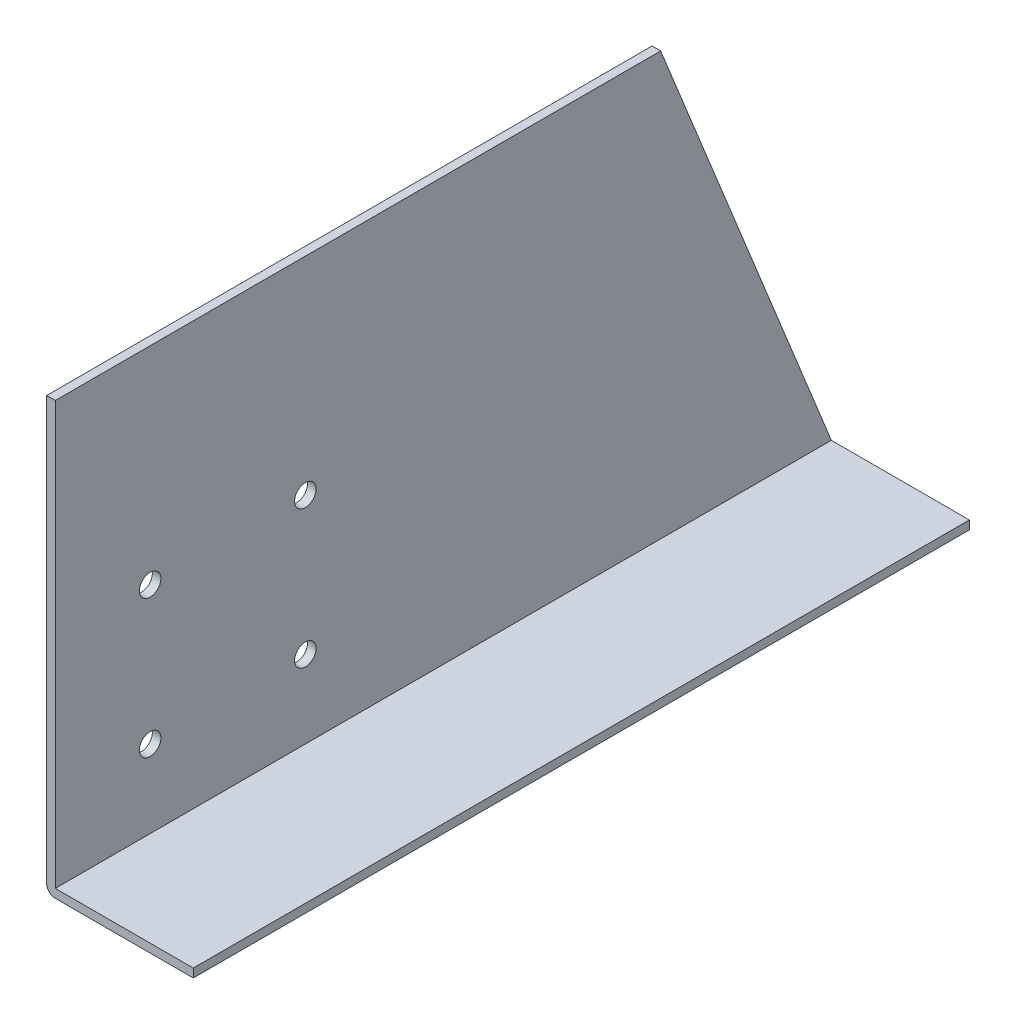
ISO-10303-21;
HEADER;
FILE_DESCRIPTION(('STEP AP214'),'2;1');
FILE_NAME('part.step','',(''),(''),'','','');
FILE_SCHEMA(('AUTOMOTIVE_DESIGN { 1 0 10303 214 1 1 1 1 }'));
ENDSEC;
DATA;
#1=APPLICATION_CONTEXT('core data for automotive mechanical design processes');
#2=APPLICATION_PROTOCOL_DEFINITION('international standard','automotive_design',2000,#1);
#3=PRODUCT_CONTEXT('',#1,'mechanical');
#4=PRODUCT('Part','Part','',(#3));
#5=PRODUCT_RELATED_PRODUCT_CATEGORY('part','',(#4));
#6=PRODUCT_DEFINITION_FORMATION('','',#4);
#7=PRODUCT_DEFINITION_CONTEXT('part definition',#1,'design');
#8=PRODUCT_DEFINITION('design','',#6,#7);
#9=PRODUCT_DEFINITION_SHAPE('','',#8);
#10=(LENGTH_UNIT() NAMED_UNIT(*) SI_UNIT(.MILLI.,.METRE.));
#11=(NAMED_UNIT(*) PLANE_ANGLE_UNIT() SI_UNIT($,.RADIAN.));
#12=(NAMED_UNIT(*) SI_UNIT($,.STERADIAN.) SOLID_ANGLE_UNIT());
#13=UNCERTAINTY_MEASURE_WITH_UNIT(LENGTH_MEASURE(1.E-05),#10,'distance_accuracy_value','');
#14=(GEOMETRIC_REPRESENTATION_CONTEXT(3) GLOBAL_UNCERTAINTY_ASSIGNED_CONTEXT((#13)) GLOBAL_UNIT_ASSIGNED_CONTEXT((#10,
#11,#12)) REPRESENTATION_CONTEXT('',''));
#15=CARTESIAN_POINT('',(0.,0.,0.));
#16=DIRECTION('',(0.,0.,1.));
#17=DIRECTION('',(1.,0.,0.));
#18=AXIS2_PLACEMENT_3D('',#15,#16,#17);
#19=CARTESIAN_POINT('',(17.,-48.,180.));
#20=DIRECTION('',(-1.,0.,0.));
#21=DIRECTION('',(0.,-1.,0.));
#22=AXIS2_PLACEMENT_3D('',#19,#20,#21);
#23=PLANE('',#22);
#24=DIRECTION('',(0.,1.,0.));
#25=VECTOR('',#24,1.);
#26=CARTESIAN_POINT('',(17.,-48.,0.));
#27=LINE('',#26,#25);
#28=CARTESIAN_POINT('',(17.,-50.,0.));
#29=VERTEX_POINT('',#28);
#30=CARTESIAN_POINT('',(17.,-48.,0.));
#31=VERTEX_POINT('',#30);
#32=EDGE_CURVE('E142',#29,#31,#27,.T.);
#33=ORIENTED_EDGE('',*,*,#32,.T.);
#34=DIRECTION('',(0.,0.,-1.));
#35=VECTOR('',#34,1.);
#36=CARTESIAN_POINT('',(17.,-48.,180.));
#37=LINE('',#36,#35);
#38=CARTESIAN_POINT('',(17.,-48.,180.));
#39=VERTEX_POINT('',#38);
#40=EDGE_CURVE('E124',#39,#31,#37,.T.);
#41=ORIENTED_EDGE('',*,*,#40,.F.);
#42=DIRECTION('',(0.,1.,0.));
#43=VECTOR('',#42,1.);
#44=CARTESIAN_POINT('',(17.,-48.,180.));
#45=LINE('',#44,#43);
#46=CARTESIAN_POINT('',(17.,-50.,180.));
#47=VERTEX_POINT('',#46);
#48=EDGE_CURVE('E139',#47,#39,#45,.T.);
#49=ORIENTED_EDGE('',*,*,#48,.F.);
#50=DIRECTION('',(0.,0.,-1.));
#51=VECTOR('',#50,1.);
#52=CARTESIAN_POINT('',(17.,-50.,180.));
#53=LINE('',#52,#51);
#54=EDGE_CURVE('E134',#47,#29,#53,.T.);
#55=ORIENTED_EDGE('',*,*,#54,.T.);
#56=EDGE_LOOP('',(#33,#41,#49,#55));
#57=FACE_BOUND('',#56,.T.);
#58=ADVANCED_FACE('F38',(#57),#23,.F.);
#59=CARTESIAN_POINT('',(-15.,-48.,180.));
#60=DIRECTION('',(0.,-1.,0.));
#61=DIRECTION('',(0.,0.,-1.));
#62=AXIS2_PLACEMENT_3D('',#59,#60,#61);
#63=PLANE('',#62);
#64=DIRECTION('',(-1.,0.,0.));
#65=VECTOR('',#64,1.);
#66=CARTESIAN_POINT('',(-15.,-48.,0.));
#67=LINE('',#66,#65);
#68=CARTESIAN_POINT('',(-15.,-48.,0.));
#69=VERTEX_POINT('',#68);
#70=EDGE_CURVE('E140',#31,#69,#67,.T.);
#71=ORIENTED_EDGE('',*,*,#70,.T.);
#72=DIRECTION('',(0.,0.,-1.));
#73=VECTOR('',#72,1.);
#74=CARTESIAN_POINT('',(-15.,-48.,180.));
#75=LINE('',#74,#73);
#76=CARTESIAN_POINT('',(-15.,-48.,180.));
#77=VERTEX_POINT('',#76);
#78=EDGE_CURVE('E127',#77,#69,#75,.T.);
#79=ORIENTED_EDGE('',*,*,#78,.F.);
#80=DIRECTION('',(-1.,0.,0.));
#81=VECTOR('',#80,1.);
#82=CARTESIAN_POINT('',(-15.,-48.,180.));
#83=LINE('',#82,#81);
#84=EDGE_CURVE('E153',#39,#77,#83,.T.);
#85=ORIENTED_EDGE('',*,*,#84,.F.);
#86=ORIENTED_EDGE('',*,*,#40,.T.);
#87=EDGE_LOOP('',(#71,#79,#85,#86));
#88=FACE_BOUND('',#87,.T.);
#89=ADVANCED_FACE('F189',(#88),#63,.F.);
#90=CARTESIAN_POINT('',(-15.,50.,180.));
#91=DIRECTION('',(-1.,0.,0.));
#92=DIRECTION('',(0.,-1.,0.));
#93=AXIS2_PLACEMENT_3D('',#90,#91,#92);
#94=PLANE('',#93);
#95=CARTESIAN_POINT('',(-15.,1.99999999999998,122.));
#96=DIRECTION('',(-1.,0.,0.));
#97=DIRECTION('',(0.,-1.,0.));
#98=AXIS2_PLACEMENT_3D('',#95,#96,#97);
#99=CIRCLE('',#98,2.5);
#100=CARTESIAN_POINT('',(-15.,-0.500000000000015,122.));
#101=VERTEX_POINT('',#100);
#102=EDGE_CURVE('E145',#101,#101,#99,.T.);
#103=ORIENTED_EDGE('',*,*,#102,.T.);
#104=EDGE_LOOP('',(#103));
#105=FACE_BOUND('',#104,.T.);
#106=CARTESIAN_POINT('',(-15.,-30.,122.));
#107=DIRECTION('',(-1.,0.,0.));
#108=DIRECTION('',(0.,-1.,0.));
#109=AXIS2_PLACEMENT_3D('',#106,#107,#108);
#110=CIRCLE('',#109,2.5);
#111=CARTESIAN_POINT('',(-15.,-32.5,122.));
#112=VERTEX_POINT('',#111);
#113=EDGE_CURVE('E159',#112,#112,#110,.T.);
#114=ORIENTED_EDGE('',*,*,#113,.T.);
#115=EDGE_LOOP('',(#114));
#116=FACE_BOUND('',#115,.T.);
#117=CARTESIAN_POINT('',(-15.,-30.,158.));
#118=DIRECTION('',(-1.,0.,0.));
#119=DIRECTION('',(0.,-1.,0.));
#120=AXIS2_PLACEMENT_3D('',#117,#118,#119);
#121=CIRCLE('',#120,2.5);
#122=CARTESIAN_POINT('',(-15.,-32.5,158.));
#123=VERTEX_POINT('',#122);
#124=EDGE_CURVE('E162',#123,#123,#121,.T.);
#125=ORIENTED_EDGE('',*,*,#124,.T.);
#126=EDGE_LOOP('',(#125));
#127=FACE_BOUND('',#126,.T.);
#128=CARTESIAN_POINT('',(-15.,1.99999999999999,158.));
#129=DIRECTION('',(-1.,0.,0.));
#130=DIRECTION('',(0.,-1.,0.));
#131=AXIS2_PLACEMENT_3D('',#128,#129,#130);
#132=CIRCLE('',#131,2.49999999999997);
#133=CARTESIAN_POINT('',(-15.,-0.499999999999976,158.));
#134=VERTEX_POINT('',#133);
#135=EDGE_CURVE('E165',#134,#134,#132,.T.);
#136=ORIENTED_EDGE('',*,*,#135,.T.);
#137=EDGE_LOOP('',(#136));
#138=FACE_BOUND('',#137,.T.);
#139=ORIENTED_EDGE('',*,*,#78,.T.);
#140=DIRECTION('',(0.,0.92718385456679,0.374606593415906));
#141=VECTOR('',#140,1.);
#142=CARTESIAN_POINT('',(-15.,98.7669035579032,59.297678122011));
#143=LINE('',#142,#141);
#144=CARTESIAN_POINT('',(-15.,50.,39.5945701318446));
#145=VERTEX_POINT('',#144);
#146=EDGE_CURVE('E100',#69,#145,#143,.T.);
#147=ORIENTED_EDGE('',*,*,#146,.T.);
#148=DIRECTION('',(0.,0.,-1.));
#149=VECTOR('',#148,1.);
#150=CARTESIAN_POINT('',(-15.,50.,180.));
#151=LINE('',#150,#149);
#152=CARTESIAN_POINT('',(-15.,50.,180.));
#153=VERTEX_POINT('',#152);
#154=EDGE_CURVE('E130',#153,#145,#151,.T.);
#155=ORIENTED_EDGE('',*,*,#154,.F.);
#156=DIRECTION('',(0.,1.,0.));
#157=VECTOR('',#156,1.);
#158=CARTESIAN_POINT('',(-15.,50.,180.));
#159=LINE('',#158,#157);
#160=EDGE_CURVE('E151',#77,#153,#159,.T.);
#161=ORIENTED_EDGE('',*,*,#160,.F.);
#162=EDGE_LOOP('',(#139,#147,#155,#161));
#163=FACE_BOUND('',#162,.T.);
#164=ADVANCED_FACE('F185',(#105,#116,#127,#138,#163),#94,.F.);
#165=CARTESIAN_POINT('',(-17.,50.,180.));
#166=DIRECTION('',(0.,-1.,0.));
#167=DIRECTION('',(0.,0.,-1.));
#168=AXIS2_PLACEMENT_3D('',#165,#166,#167);
#169=PLANE('',#168);
#170=ORIENTED_EDGE('',*,*,#154,.T.);
#171=DIRECTION('',(-1.,0.,0.));
#172=VECTOR('',#171,1.);
#173=CARTESIAN_POINT('',(163.,50.,39.5945701318446));
#174=LINE('',#173,#172);
#175=CARTESIAN_POINT('',(-17.,50.,39.5945701318446));
#176=VERTEX_POINT('',#175);
#177=EDGE_CURVE('E104',#145,#176,#174,.T.);
#178=ORIENTED_EDGE('',*,*,#177,.T.);
#179=DIRECTION('',(0.,0.,-1.));
#180=VECTOR('',#179,1.);
#181=CARTESIAN_POINT('',(-17.,50.,180.));
#182=LINE('',#181,#180);
#183=CARTESIAN_POINT('',(-17.,50.,180.));
#184=VERTEX_POINT('',#183);
#185=EDGE_CURVE('E109',#184,#176,#182,.T.);
#186=ORIENTED_EDGE('',*,*,#185,.F.);
#187=DIRECTION('',(-1.,0.,0.));
#188=VECTOR('',#187,1.);
#189=CARTESIAN_POINT('',(-17.,50.,180.));
#190=LINE('',#189,#188);
#191=EDGE_CURVE('E149',#153,#184,#190,.T.);
#192=ORIENTED_EDGE('',*,*,#191,.F.);
#193=EDGE_LOOP('',(#170,#178,#186,#192));
#194=FACE_BOUND('',#193,.T.);
#195=ADVANCED_FACE('F181',(#194),#169,.F.);
#196=CARTESIAN_POINT('',(-17.,50.,180.));
#197=DIRECTION('',(1.,0.,0.));
#198=DIRECTION('',(0.,1.,0.));
#199=AXIS2_PLACEMENT_3D('',#196,#197,#198);
#200=PLANE('',#199);
#201=CARTESIAN_POINT('',(-17.,1.99999999999998,122.));
#202=DIRECTION('',(-1.,0.,0.));
#203=DIRECTION('',(0.,-1.,0.));
#204=AXIS2_PLACEMENT_3D('',#201,#202,#203);
#205=CIRCLE('',#204,2.5);
#206=CARTESIAN_POINT('',(-17.,-0.500000000000016,122.));
#207=VERTEX_POINT('',#206);
#208=EDGE_CURVE('E110',#207,#207,#205,.T.);
#209=ORIENTED_EDGE('',*,*,#208,.F.);
#210=EDGE_LOOP('',(#209));
#211=FACE_BOUND('',#210,.T.);
#212=CARTESIAN_POINT('',(-17.,-30.,122.));
#213=DIRECTION('',(-1.,0.,0.));
#214=DIRECTION('',(0.,-1.,0.));
#215=AXIS2_PLACEMENT_3D('',#212,#213,#214);
#216=CIRCLE('',#215,2.5);
#217=CARTESIAN_POINT('',(-17.,-32.5,122.));
#218=VERTEX_POINT('',#217);
#219=EDGE_CURVE('E175',#218,#218,#216,.T.);
#220=ORIENTED_EDGE('',*,*,#219,.F.);
#221=EDGE_LOOP('',(#220));
#222=FACE_BOUND('',#221,.T.);
#223=CARTESIAN_POINT('',(-17.,-30.,158.));
#224=DIRECTION('',(-1.,0.,0.));
#225=DIRECTION('',(0.,1.,0.));
#226=AXIS2_PLACEMENT_3D('',#223,#224,#225);
#227=CIRCLE('',#226,2.5);
#228=CARTESIAN_POINT('',(-17.,-32.5,158.));
#229=VERTEX_POINT('',#228);
#230=EDGE_CURVE('E172',#229,#229,#227,.T.);
#231=ORIENTED_EDGE('',*,*,#230,.F.);
#232=EDGE_LOOP('',(#231));
#233=FACE_BOUND('',#232,.T.);
#234=CARTESIAN_POINT('',(-17.,1.99999999999999,158.));
#235=DIRECTION('',(-1.,0.,0.));
#236=DIRECTION('',(0.,1.,0.));
#237=AXIS2_PLACEMENT_3D('',#234,#235,#236);
#238=CIRCLE('',#237,2.49999999999997);
#239=CARTESIAN_POINT('',(-17.,-0.499999999999976,158.));
#240=VERTEX_POINT('',#239);
#241=EDGE_CURVE('E169',#240,#240,#238,.T.);
#242=ORIENTED_EDGE('',*,*,#241,.F.);
#243=EDGE_LOOP('',(#242));
#244=FACE_BOUND('',#243,.T.);
#245=ORIENTED_EDGE('',*,*,#185,.T.);
#246=DIRECTION('',(0.,0.92718385456679,0.374606593415906));
#247=VECTOR('',#246,1.);
#248=CARTESIAN_POINT('',(-17.,-48.,0.));
#249=LINE('',#248,#247);
#250=CARTESIAN_POINT('',(-17.,-48.,0.));
#251=VERTEX_POINT('',#250);
#252=EDGE_CURVE('E97',#251,#176,#249,.T.);
#253=ORIENTED_EDGE('',*,*,#252,.F.);
#254=DIRECTION('',(0.,0.,-1.));
#255=VECTOR('',#254,1.);
#256=CARTESIAN_POINT('',(-17.,-48.,180.));
#257=LINE('',#256,#255);
#258=CARTESIAN_POINT('',(-17.,-48.,180.));
#259=VERTEX_POINT('',#258);
#260=EDGE_CURVE('E46',#251,#259,#257,.F.);
#261=ORIENTED_EDGE('',*,*,#260,.T.);
#262=DIRECTION('',(0.,-1.,0.));
#263=VECTOR('',#262,1.);
#264=CARTESIAN_POINT('',(-17.,50.,180.));
#265=LINE('',#264,#263);
#266=EDGE_CURVE('E147',#184,#259,#265,.T.);
#267=ORIENTED_EDGE('',*,*,#266,.F.);
#268=EDGE_LOOP('',(#245,#253,#261,#267));
#269=FACE_BOUND('',#268,.T.);
#270=ADVANCED_FACE('F107',(#211,#222,#233,#244,#269),#200,.F.);
#271=CARTESIAN_POINT('',(-17.,-50.,180.));
#272=DIRECTION('',(0.,1.,0.));
#273=DIRECTION('',(0.,0.,1.));
#274=AXIS2_PLACEMENT_3D('',#271,#272,#273);
#275=PLANE('',#274);
#276=DIRECTION('',(1.,0.,0.));
#277=VECTOR('',#276,1.);
#278=CARTESIAN_POINT('',(-17.,-50.,180.));
#279=LINE('',#278,#277);
#280=CARTESIAN_POINT('',(-15.,-50.,180.));
#281=VERTEX_POINT('',#280);
#282=EDGE_CURVE('E137',#281,#47,#279,.T.);
#283=ORIENTED_EDGE('',*,*,#282,.F.);
#284=DIRECTION('',(0.,0.,-1.));
#285=VECTOR('',#284,1.);
#286=CARTESIAN_POINT('',(-15.,-50.,180.));
#287=LINE('',#286,#285);
#288=CARTESIAN_POINT('',(-15.,-50.,0.));
#289=VERTEX_POINT('',#288);
#290=EDGE_CURVE('E120',#281,#289,#287,.T.);
#291=ORIENTED_EDGE('',*,*,#290,.T.);
#292=DIRECTION('',(1.,0.,0.));
#293=VECTOR('',#292,1.);
#294=CARTESIAN_POINT('',(-17.,-50.,0.));
#295=LINE('',#294,#293);
#296=EDGE_CURVE('E116',#289,#29,#295,.T.);
#297=ORIENTED_EDGE('',*,*,#296,.T.);
#298=ORIENTED_EDGE('',*,*,#54,.F.);
#299=EDGE_LOOP('',(#283,#291,#297,#298));
#300=FACE_BOUND('',#299,.T.);
#301=ADVANCED_FACE('F195',(#300),#275,.F.);
#302=CARTESIAN_POINT('',(0.,0.,180.));
#303=DIRECTION('',(0.,0.,1.));
#304=DIRECTION('',(1.,0.,0.));
#305=AXIS2_PLACEMENT_3D('',#302,#303,#304);
#306=PLANE('',#305);
#307=ORIENTED_EDGE('',*,*,#266,.T.);
#308=CARTESIAN_POINT('',(-15.,-48.,180.));
#309=DIRECTION('',(0.,0.,1.));
#310=DIRECTION('',(1.,0.,0.));
#311=AXIS2_PLACEMENT_3D('',#308,#309,#310);
#312=CIRCLE('',#311,2.);
#313=EDGE_CURVE('E11',#259,#281,#312,.T.);
#314=ORIENTED_EDGE('',*,*,#313,.T.);
#315=ORIENTED_EDGE('',*,*,#282,.T.);
#316=ORIENTED_EDGE('',*,*,#48,.T.);
#317=ORIENTED_EDGE('',*,*,#84,.T.);
#318=ORIENTED_EDGE('',*,*,#160,.T.);
#319=ORIENTED_EDGE('',*,*,#191,.T.);
#320=EDGE_LOOP('',(#307,#314,#315,#316,#317,#318,#319));
#321=FACE_BOUND('',#320,.T.);
#322=ADVANCED_FACE('F196',(#321),#306,.T.);
#323=CARTESIAN_POINT('',(0.,0.,0.));
#324=DIRECTION('',(0.,0.,1.));
#325=DIRECTION('',(1.,0.,0.));
#326=AXIS2_PLACEMENT_3D('',#323,#324,#325);
#327=PLANE('',#326);
#328=CARTESIAN_POINT('',(-15.,-48.,0.));
#329=DIRECTION('',(0.,0.,1.));
#330=DIRECTION('',(1.,0.,0.));
#331=AXIS2_PLACEMENT_3D('',#328,#329,#330);
#332=CIRCLE('',#331,2.);
#333=EDGE_CURVE('E113',#289,#251,#332,.F.);
#334=ORIENTED_EDGE('',*,*,#333,.T.);
#335=DIRECTION('',(-1.,0.,0.));
#336=VECTOR('',#335,1.);
#337=CARTESIAN_POINT('',(163.,-48.,0.));
#338=LINE('',#337,#336);
#339=EDGE_CURVE('E95',#69,#251,#338,.T.);
#340=ORIENTED_EDGE('',*,*,#339,.F.);
#341=ORIENTED_EDGE('',*,*,#70,.F.);
#342=ORIENTED_EDGE('',*,*,#32,.F.);
#343=ORIENTED_EDGE('',*,*,#296,.F.);
#344=EDGE_LOOP('',(#334,#340,#341,#342,#343));
#345=FACE_BOUND('',#344,.T.);
#346=ADVANCED_FACE('F114',(#345),#327,.F.);
#347=CARTESIAN_POINT('',(-15.,-48.,180.));
#348=DIRECTION('',(0.,0.,-1.));
#349=DIRECTION('',(-1.,0.,0.));
#350=AXIS2_PLACEMENT_3D('',#347,#348,#349);
#351=CYLINDRICAL_SURFACE('',#350,2.);
#352=ORIENTED_EDGE('',*,*,#313,.F.);
#353=ORIENTED_EDGE('',*,*,#260,.F.);
#354=ORIENTED_EDGE('',*,*,#333,.F.);
#355=ORIENTED_EDGE('',*,*,#290,.F.);
#356=EDGE_LOOP('',(#352,#353,#354,#355));
#357=FACE_BOUND('',#356,.T.);
#358=ADVANCED_FACE('F40',(#357),#351,.T.);
#359=CARTESIAN_POINT('',(163.,-48.,0.));
#360=DIRECTION('',(0.,-0.374606593415906,0.92718385456679));
#361=DIRECTION('',(0.,-0.92718385456679,-0.374606593415906));
#362=AXIS2_PLACEMENT_3D('',#359,#360,#361);
#363=PLANE('',#362);
#364=ORIENTED_EDGE('',*,*,#339,.T.);
#365=ORIENTED_EDGE('',*,*,#252,.T.);
#366=ORIENTED_EDGE('',*,*,#177,.F.);
#367=ORIENTED_EDGE('',*,*,#146,.F.);
#368=EDGE_LOOP('',(#364,#365,#366,#367));
#369=FACE_BOUND('',#368,.T.);
#370=ADVANCED_FACE('F96',(#369),#363,.F.);
#371=CARTESIAN_POINT('',(163.,2.00000000000001,158.));
#372=DIRECTION('',(-1.,0.,0.));
#373=DIRECTION('',(0.,-1.,0.));
#374=AXIS2_PLACEMENT_3D('',#371,#372,#373);
#375=CYLINDRICAL_SURFACE('',#374,2.49999999999997);
#376=CARTESIAN_POINT('',(-17.,-0.499999999999976,158.));
#377=CARTESIAN_POINT('',(-16.9791666666667,-0.499999999999976,158.));
#378=CARTESIAN_POINT('',(-16.9583333333334,-0.499999999999976,158.));
#379=CARTESIAN_POINT('',(-16.9166666666667,-0.499999999999976,158.));
#380=CARTESIAN_POINT('',(-16.8958333333334,-0.499999999999976,158.));
#381=CARTESIAN_POINT('',(-16.8541666666667,-0.499999999999976,158.));
#382=CARTESIAN_POINT('',(-16.8333333333334,-0.499999999999976,158.));
#383=CARTESIAN_POINT('',(-16.7916666666667,-0.499999999999976,158.));
#384=CARTESIAN_POINT('',(-16.7708333333334,-0.499999999999976,158.));
#385=CARTESIAN_POINT('',(-16.7291666666667,-0.499999999999976,158.));
#386=CARTESIAN_POINT('',(-16.7083333333334,-0.499999999999976,158.));
#387=CARTESIAN_POINT('',(-16.6666666666667,-0.499999999999976,158.));
#388=CARTESIAN_POINT('',(-16.6458333333334,-0.499999999999976,158.));
#389=CARTESIAN_POINT('',(-16.6041666666667,-0.499999999999976,158.));
#390=CARTESIAN_POINT('',(-16.5833333333334,-0.499999999999976,158.));
#391=CARTESIAN_POINT('',(-16.5416666666667,-0.499999999999976,158.));
#392=CARTESIAN_POINT('',(-16.5208333333334,-0.499999999999976,158.));
#393=CARTESIAN_POINT('',(-16.4791666666667,-0.499999999999976,158.));
#394=CARTESIAN_POINT('',(-16.4583333333334,-0.499999999999976,158.));
#395=CARTESIAN_POINT('',(-16.4166666666667,-0.499999999999976,158.));
#396=CARTESIAN_POINT('',(-16.3958333333334,-0.499999999999976,158.));
#397=CARTESIAN_POINT('',(-16.3541666666667,-0.499999999999976,158.));
#398=CARTESIAN_POINT('',(-16.3333333333334,-0.499999999999976,158.));
#399=CARTESIAN_POINT('',(-16.2916666666667,-0.499999999999976,158.));
#400=CARTESIAN_POINT('',(-16.2708333333334,-0.499999999999976,158.));
#401=CARTESIAN_POINT('',(-16.2291666666667,-0.499999999999976,158.));
#402=CARTESIAN_POINT('',(-16.2083333333334,-0.499999999999976,158.));
#403=CARTESIAN_POINT('',(-16.1666666666667,-0.499999999999976,158.));
#404=CARTESIAN_POINT('',(-16.1458333333334,-0.499999999999976,158.));
#405=CARTESIAN_POINT('',(-16.1041666666667,-0.499999999999976,158.));
#406=CARTESIAN_POINT('',(-16.0833333333333,-0.499999999999976,158.));
#407=CARTESIAN_POINT('',(-16.0416666666667,-0.499999999999976,158.));
#408=CARTESIAN_POINT('',(-16.0208333333333,-0.499999999999976,158.));
#409=CARTESIAN_POINT('',(-15.9791666666667,-0.499999999999976,158.));
#410=CARTESIAN_POINT('',(-15.9583333333334,-0.499999999999976,158.));
#411=CARTESIAN_POINT('',(-15.9166666666667,-0.499999999999976,158.));
#412=CARTESIAN_POINT('',(-15.8958333333333,-0.499999999999976,158.));
#413=CARTESIAN_POINT('',(-15.8541666666667,-0.499999999999976,158.));
#414=CARTESIAN_POINT('',(-15.8333333333333,-0.499999999999976,158.));
#415=CARTESIAN_POINT('',(-15.7916666666667,-0.499999999999976,158.));
#416=CARTESIAN_POINT('',(-15.7708333333333,-0.499999999999976,158.));
#417=CARTESIAN_POINT('',(-15.7291666666667,-0.499999999999976,158.));
#418=CARTESIAN_POINT('',(-15.7083333333333,-0.499999999999976,158.));
#419=CARTESIAN_POINT('',(-15.6666666666667,-0.499999999999976,158.));
#420=CARTESIAN_POINT('',(-15.6458333333333,-0.499999999999976,158.));
#421=CARTESIAN_POINT('',(-15.6041666666667,-0.499999999999976,158.));
#422=CARTESIAN_POINT('',(-15.5833333333333,-0.499999999999976,158.));
#423=CARTESIAN_POINT('',(-15.5416666666667,-0.499999999999976,158.));
#424=CARTESIAN_POINT('',(-15.5208333333333,-0.499999999999976,158.));
#425=CARTESIAN_POINT('',(-15.4791666666667,-0.499999999999976,158.));
#426=CARTESIAN_POINT('',(-15.4583333333333,-0.499999999999976,158.));
#427=CARTESIAN_POINT('',(-15.4166666666667,-0.499999999999976,158.));
#428=CARTESIAN_POINT('',(-15.3958333333333,-0.499999999999976,158.));
#429=CARTESIAN_POINT('',(-15.3541666666667,-0.499999999999976,158.));
#430=CARTESIAN_POINT('',(-15.3333333333333,-0.499999999999976,158.));
#431=CARTESIAN_POINT('',(-15.2916666666667,-0.499999999999976,158.));
#432=CARTESIAN_POINT('',(-15.2708333333333,-0.499999999999976,158.));
#433=CARTESIAN_POINT('',(-15.2291666666667,-0.499999999999976,158.));
#434=CARTESIAN_POINT('',(-15.2083333333333,-0.499999999999976,158.));
#435=CARTESIAN_POINT('',(-15.1666666666667,-0.499999999999976,158.));
#436=CARTESIAN_POINT('',(-15.1458333333333,-0.499999999999976,158.));
#437=CARTESIAN_POINT('',(-15.1041666666667,-0.499999999999976,158.));
#438=CARTESIAN_POINT('',(-15.0833333333333,-0.499999999999976,158.));
#439=CARTESIAN_POINT('',(-15.0416666666666,-0.499999999999976,158.));
#440=CARTESIAN_POINT('',(-15.0208333333333,-0.499999999999976,158.));
#441=CARTESIAN_POINT('',(-15.,-0.499999999999976,158.));
#442=B_SPLINE_CURVE_WITH_KNOTS('',3,(#376,#377,#378,#379,#380,#381,#382,#383,#384,#385,#386,
#387,#388,#389,#390,#391,#392,#393,#394,#395,#396,#397,#398,#399,#400,#401,#402,#403,#404,#405,
#406,#407,#408,#409,#410,#411,#412,#413,#414,#415,#416,#417,#418,#419,#420,#421,#422,#423,#424,
#425,#426,#427,#428,#429,#430,#431,#432,#433,#434,#435,#436,#437,#438,#439,#440,#441),
.UNSPECIFIED.,.F.,.F.,(4,2,2,2,2,2,2,2,2,2,2,2,2,2,2,2,2,2,2,2,2,2,2,2,2,2,2,2,2,2,2,2,4),(0.,
0.0624999999999931,0.125000000000014,0.187500000000007,0.25,0.312500000000021,0.375000000000014,
0.437500000000007,0.5,0.562500000000021,0.625000000000014,0.687500000000008,0.750000000000028,
0.812500000000022,0.875000000000015,0.937500000000036,1.00000000000003,1.06250000000002,
1.12500000000004,1.18750000000004,1.25000000000003,1.31250000000005,1.37500000000004,
1.43750000000004,1.50000000000006,1.56250000000005,1.62500000000004,1.68750000000004,
1.75000000000006,1.81250000000005,1.87500000000004,1.93750000000006,2.00000000000006),.UNSPECIFIED.);
#443=EDGE_CURVE('BSEAM231',#240,#134,#442,.T.);
#444=ORIENTED_EDGE('',*,*,#241,.T.);
#445=ORIENTED_EDGE('',*,*,#135,.F.);
#446=ORIENTED_EDGE('',*,*,#443,.T.);
#447=ORIENTED_EDGE('',*,*,#443,.F.);
#448=EDGE_LOOP('',(#444,#446,#445,#447));
#449=FACE_BOUND('',#448,.T.);
#450=ADVANCED_FACE('F231',(#449),#375,.F.);
#451=CARTESIAN_POINT('',(163.,-30.,158.));
#452=DIRECTION('',(-1.,0.,0.));
#453=DIRECTION('',(0.,-1.,0.));
#454=AXIS2_PLACEMENT_3D('',#451,#452,#453);
#455=CYLINDRICAL_SURFACE('',#454,2.5);
#456=CARTESIAN_POINT('',(-17.,-32.5,158.));
#457=CARTESIAN_POINT('',(-16.9791666666667,-32.5,158.));
#458=CARTESIAN_POINT('',(-16.9583333333333,-32.5,158.));
#459=CARTESIAN_POINT('',(-16.9166666666667,-32.5,158.));
#460=CARTESIAN_POINT('',(-16.8958333333333,-32.5,158.));
#461=CARTESIAN_POINT('',(-16.8541666666667,-32.5,158.));
#462=CARTESIAN_POINT('',(-16.8333333333333,-32.5,158.));
#463=CARTESIAN_POINT('',(-16.7916666666667,-32.5,158.));
#464=CARTESIAN_POINT('',(-16.7708333333333,-32.5,158.));
#465=CARTESIAN_POINT('',(-16.7291666666667,-32.5,158.));
#466=CARTESIAN_POINT('',(-16.7083333333333,-32.5,158.));
#467=CARTESIAN_POINT('',(-16.6666666666667,-32.5,158.));
#468=CARTESIAN_POINT('',(-16.6458333333333,-32.5,158.));
#469=CARTESIAN_POINT('',(-16.6041666666666,-32.5,158.));
#470=CARTESIAN_POINT('',(-16.5833333333333,-32.5,158.));
#471=CARTESIAN_POINT('',(-16.5416666666667,-32.5,158.));
#472=CARTESIAN_POINT('',(-16.5208333333333,-32.5,158.));
#473=CARTESIAN_POINT('',(-16.4791666666667,-32.5,158.));
#474=CARTESIAN_POINT('',(-16.4583333333333,-32.5,158.));
#475=CARTESIAN_POINT('',(-16.4166666666667,-32.5,158.));
#476=CARTESIAN_POINT('',(-16.3958333333333,-32.5,158.));
#477=CARTESIAN_POINT('',(-16.3541666666667,-32.5,158.));
#478=CARTESIAN_POINT('',(-16.3333333333333,-32.5,158.));
#479=CARTESIAN_POINT('',(-16.2916666666667,-32.5,158.));
#480=CARTESIAN_POINT('',(-16.2708333333333,-32.5,158.));
#481=CARTESIAN_POINT('',(-16.2291666666667,-32.5,158.));
#482=CARTESIAN_POINT('',(-16.2083333333333,-32.5,158.));
#483=CARTESIAN_POINT('',(-16.1666666666667,-32.5,158.));
#484=CARTESIAN_POINT('',(-16.1458333333333,-32.5,158.));
#485=CARTESIAN_POINT('',(-16.1041666666666,-32.5,158.));
#486=CARTESIAN_POINT('',(-16.0833333333333,-32.5,158.));
#487=CARTESIAN_POINT('',(-16.0416666666667,-32.5,158.));
#488=CARTESIAN_POINT('',(-16.0208333333333,-32.5,158.));
#489=CARTESIAN_POINT('',(-15.9791666666667,-32.5,158.));
#490=CARTESIAN_POINT('',(-15.9583333333333,-32.5,158.));
#491=CARTESIAN_POINT('',(-15.9166666666667,-32.5,158.));
#492=CARTESIAN_POINT('',(-15.8958333333333,-32.5,158.));
#493=CARTESIAN_POINT('',(-15.8541666666667,-32.5,158.));
#494=CARTESIAN_POINT('',(-15.8333333333333,-32.5,158.));
#495=CARTESIAN_POINT('',(-15.7916666666666,-32.5,158.));
#496=CARTESIAN_POINT('',(-15.7708333333333,-32.5,158.));
#497=CARTESIAN_POINT('',(-15.7291666666667,-32.5,158.));
#498=CARTESIAN_POINT('',(-15.7083333333333,-32.5,158.));
#499=CARTESIAN_POINT('',(-15.6666666666667,-32.5,158.));
#500=CARTESIAN_POINT('',(-15.6458333333333,-32.5,158.));
#501=CARTESIAN_POINT('',(-15.6041666666666,-32.5,158.));
#502=CARTESIAN_POINT('',(-15.5833333333333,-32.5,158.));
#503=CARTESIAN_POINT('',(-15.5416666666666,-32.5,158.));
#504=CARTESIAN_POINT('',(-15.5208333333333,-32.5,158.));
#505=CARTESIAN_POINT('',(-15.4791666666667,-32.5,158.));
#506=CARTESIAN_POINT('',(-15.4583333333333,-32.5,158.));
#507=CARTESIAN_POINT('',(-15.4166666666667,-32.5,158.));
#508=CARTESIAN_POINT('',(-15.3958333333333,-32.5,158.));
#509=CARTESIAN_POINT('',(-15.3541666666667,-32.5,158.));
#510=CARTESIAN_POINT('',(-15.3333333333333,-32.5,158.));
#511=CARTESIAN_POINT('',(-15.2916666666666,-32.5,158.));
#512=CARTESIAN_POINT('',(-15.2708333333333,-32.5,158.));
#513=CARTESIAN_POINT('',(-15.2291666666667,-32.5,158.));
#514=CARTESIAN_POINT('',(-15.2083333333333,-32.5,158.));
#515=CARTESIAN_POINT('',(-15.1666666666667,-32.5,158.));
#516=CARTESIAN_POINT('',(-15.1458333333333,-32.5,158.));
#517=CARTESIAN_POINT('',(-15.1041666666666,-32.5,158.));
#518=CARTESIAN_POINT('',(-15.0833333333333,-32.5,158.));
#519=CARTESIAN_POINT('',(-15.0416666666666,-32.5,158.));
#520=CARTESIAN_POINT('',(-15.0208333333333,-32.5,158.));
#521=CARTESIAN_POINT('',(-15.,-32.5,158.));
#522=B_SPLINE_CURVE_WITH_KNOTS('',3,(#456,#457,#458,#459,#460,#461,#462,#463,#464,#465,#466,
#467,#468,#469,#470,#471,#472,#473,#474,#475,#476,#477,#478,#479,#480,#481,#482,#483,#484,#485,
#486,#487,#488,#489,#490,#491,#492,#493,#494,#495,#496,#497,#498,#499,#500,#501,#502,#503,#504,
#505,#506,#507,#508,#509,#510,#511,#512,#513,#514,#515,#516,#517,#518,#519,#520,#521),
.UNSPECIFIED.,.F.,.F.,(4,2,2,2,2,2,2,2,2,2,2,2,2,2,2,2,2,2,2,2,2,2,2,2,2,2,2,2,2,2,2,2,4),(0.,
0.0624999999999931,0.124999999999986,0.187500000000007,0.25,0.312499999999993,0.375000000000014,
0.437500000000007,0.5,0.562499999999994,0.624999999999987,0.687500000000008,0.750000000000001,
0.812499999999994,0.875000000000015,0.937500000000008,1.,1.06249999999999,1.12499999999999,
1.18750000000001,1.25,1.31249999999999,1.37500000000002,1.43750000000001,1.5,1.56249999999999,
1.62499999999999,1.68750000000001,1.75,1.81249999999999,1.87500000000002,1.93750000000001,2.),.UNSPECIFIED.);
#523=EDGE_CURVE('BSEAM234',#229,#123,#522,.T.);
#524=ORIENTED_EDGE('',*,*,#230,.T.);
#525=ORIENTED_EDGE('',*,*,#124,.F.);
#526=ORIENTED_EDGE('',*,*,#523,.T.);
#527=ORIENTED_EDGE('',*,*,#523,.F.);
#528=EDGE_LOOP('',(#524,#526,#525,#527));
#529=FACE_BOUND('',#528,.T.);
#530=ADVANCED_FACE('F234',(#529),#455,.F.);
#531=CARTESIAN_POINT('',(163.,-30.,122.));
#532=DIRECTION('',(-1.,0.,0.));
#533=DIRECTION('',(0.,-1.,0.));
#534=AXIS2_PLACEMENT_3D('',#531,#532,#533);
#535=CYLINDRICAL_SURFACE('',#534,2.5);
#536=CARTESIAN_POINT('',(-17.,-32.5,122.));
#537=CARTESIAN_POINT('',(-16.9791666666667,-32.5,122.));
#538=CARTESIAN_POINT('',(-16.9583333333333,-32.5,122.));
#539=CARTESIAN_POINT('',(-16.9166666666667,-32.5,122.));
#540=CARTESIAN_POINT('',(-16.8958333333333,-32.5,122.));
#541=CARTESIAN_POINT('',(-16.8541666666667,-32.5,122.));
#542=CARTESIAN_POINT('',(-16.8333333333333,-32.5,122.));
#543=CARTESIAN_POINT('',(-16.7916666666667,-32.5,122.));
#544=CARTESIAN_POINT('',(-16.7708333333333,-32.5,122.));
#545=CARTESIAN_POINT('',(-16.7291666666667,-32.5,122.));
#546=CARTESIAN_POINT('',(-16.7083333333333,-32.5,122.));
#547=CARTESIAN_POINT('',(-16.6666666666667,-32.5,122.));
#548=CARTESIAN_POINT('',(-16.6458333333333,-32.5,122.));
#549=CARTESIAN_POINT('',(-16.6041666666666,-32.5,122.));
#550=CARTESIAN_POINT('',(-16.5833333333333,-32.5,122.));
#551=CARTESIAN_POINT('',(-16.5416666666667,-32.5,122.));
#552=CARTESIAN_POINT('',(-16.5208333333333,-32.5,122.));
#553=CARTESIAN_POINT('',(-16.4791666666667,-32.5,122.));
#554=CARTESIAN_POINT('',(-16.4583333333333,-32.5,122.));
#555=CARTESIAN_POINT('',(-16.4166666666667,-32.5,122.));
#556=CARTESIAN_POINT('',(-16.3958333333333,-32.5,122.));
#557=CARTESIAN_POINT('',(-16.3541666666667,-32.5,122.));
#558=CARTESIAN_POINT('',(-16.3333333333333,-32.5,122.));
#559=CARTESIAN_POINT('',(-16.2916666666667,-32.5,122.));
#560=CARTESIAN_POINT('',(-16.2708333333333,-32.5,122.));
#561=CARTESIAN_POINT('',(-16.2291666666667,-32.5,122.));
#562=CARTESIAN_POINT('',(-16.2083333333333,-32.5,122.));
#563=CARTESIAN_POINT('',(-16.1666666666667,-32.5,122.));
#564=CARTESIAN_POINT('',(-16.1458333333333,-32.5,122.));
#565=CARTESIAN_POINT('',(-16.1041666666666,-32.5,122.));
#566=CARTESIAN_POINT('',(-16.0833333333333,-32.5,122.));
#567=CARTESIAN_POINT('',(-16.0416666666667,-32.5,122.));
#568=CARTESIAN_POINT('',(-16.0208333333333,-32.5,122.));
#569=CARTESIAN_POINT('',(-15.9791666666667,-32.5,122.));
#570=CARTESIAN_POINT('',(-15.9583333333333,-32.5,122.));
#571=CARTESIAN_POINT('',(-15.9166666666667,-32.5,122.));
#572=CARTESIAN_POINT('',(-15.8958333333333,-32.5,122.));
#573=CARTESIAN_POINT('',(-15.8541666666667,-32.5,122.));
#574=CARTESIAN_POINT('',(-15.8333333333333,-32.5,122.));
#575=CARTESIAN_POINT('',(-15.7916666666666,-32.5,122.));
#576=CARTESIAN_POINT('',(-15.7708333333333,-32.5,122.));
#577=CARTESIAN_POINT('',(-15.7291666666667,-32.5,122.));
#578=CARTESIAN_POINT('',(-15.7083333333333,-32.5,122.));
#579=CARTESIAN_POINT('',(-15.6666666666667,-32.5,122.));
#580=CARTESIAN_POINT('',(-15.6458333333333,-32.5,122.));
#581=CARTESIAN_POINT('',(-15.6041666666666,-32.5,122.));
#582=CARTESIAN_POINT('',(-15.5833333333333,-32.5,122.));
#583=CARTESIAN_POINT('',(-15.5416666666666,-32.5,122.));
#584=CARTESIAN_POINT('',(-15.5208333333333,-32.5,122.));
#585=CARTESIAN_POINT('',(-15.4791666666667,-32.5,122.));
#586=CARTESIAN_POINT('',(-15.4583333333333,-32.5,122.));
#587=CARTESIAN_POINT('',(-15.4166666666667,-32.5,122.));
#588=CARTESIAN_POINT('',(-15.3958333333333,-32.5,122.));
#589=CARTESIAN_POINT('',(-15.3541666666667,-32.5,122.));
#590=CARTESIAN_POINT('',(-15.3333333333333,-32.5,122.));
#591=CARTESIAN_POINT('',(-15.2916666666666,-32.5,122.));
#592=CARTESIAN_POINT('',(-15.2708333333333,-32.5,122.));
#593=CARTESIAN_POINT('',(-15.2291666666667,-32.5,122.));
#594=CARTESIAN_POINT('',(-15.2083333333333,-32.5,122.));
#595=CARTESIAN_POINT('',(-15.1666666666667,-32.5,122.));
#596=CARTESIAN_POINT('',(-15.1458333333333,-32.5,122.));
#597=CARTESIAN_POINT('',(-15.1041666666666,-32.5,122.));
#598=CARTESIAN_POINT('',(-15.0833333333333,-32.5,122.));
#599=CARTESIAN_POINT('',(-15.0416666666666,-32.5,122.));
#600=CARTESIAN_POINT('',(-15.0208333333333,-32.5,122.));
#601=CARTESIAN_POINT('',(-15.,-32.5,122.));
#602=B_SPLINE_CURVE_WITH_KNOTS('',3,(#536,#537,#538,#539,#540,#541,#542,#543,#544,#545,#546,
#547,#548,#549,#550,#551,#552,#553,#554,#555,#556,#557,#558,#559,#560,#561,#562,#563,#564,#565,
#566,#567,#568,#569,#570,#571,#572,#573,#574,#575,#576,#577,#578,#579,#580,#581,#582,#583,#584,
#585,#586,#587,#588,#589,#590,#591,#592,#593,#594,#595,#596,#597,#598,#599,#600,#601),
.UNSPECIFIED.,.F.,.F.,(4,2,2,2,2,2,2,2,2,2,2,2,2,2,2,2,2,2,2,2,2,2,2,2,2,2,2,2,2,2,2,2,4),(0.,
0.0624999999999931,0.124999999999986,0.187500000000007,0.25,0.312499999999993,0.375000000000014,
0.437500000000007,0.5,0.562499999999994,0.624999999999987,0.687500000000008,0.750000000000001,
0.812499999999994,0.875000000000015,0.937500000000008,1.,1.06249999999999,1.12499999999999,
1.18750000000001,1.25,1.31249999999999,1.37500000000002,1.43750000000001,1.5,1.56249999999999,
1.62499999999999,1.68750000000001,1.75,1.81249999999999,1.87500000000002,1.93750000000001,2.),.UNSPECIFIED.);
#603=EDGE_CURVE('BSEAM241',#218,#112,#602,.T.);
#604=ORIENTED_EDGE('',*,*,#219,.T.);
#605=ORIENTED_EDGE('',*,*,#113,.F.);
#606=ORIENTED_EDGE('',*,*,#603,.T.);
#607=ORIENTED_EDGE('',*,*,#603,.F.);
#608=EDGE_LOOP('',(#604,#606,#605,#607));
#609=FACE_BOUND('',#608,.T.);
#610=ADVANCED_FACE('F241',(#609),#535,.F.);
#611=CARTESIAN_POINT('',(163.,1.99999999999999,122.));
#612=DIRECTION('',(-1.,0.,0.));
#613=DIRECTION('',(0.,-1.,0.));
#614=AXIS2_PLACEMENT_3D('',#611,#612,#613);
#615=CYLINDRICAL_SURFACE('',#614,2.5);
#616=CARTESIAN_POINT('',(-17.,-0.500000000000016,122.));
#617=CARTESIAN_POINT('',(-16.9791666666667,-0.500000000000016,122.));
#618=CARTESIAN_POINT('',(-16.9583333333334,-0.500000000000016,122.));
#619=CARTESIAN_POINT('',(-16.9166666666667,-0.500000000000016,122.));
#620=CARTESIAN_POINT('',(-16.8958333333334,-0.500000000000016,122.));
#621=CARTESIAN_POINT('',(-16.8541666666667,-0.500000000000016,122.));
#622=CARTESIAN_POINT('',(-16.8333333333334,-0.500000000000016,122.));
#623=CARTESIAN_POINT('',(-16.7916666666667,-0.500000000000016,122.));
#624=CARTESIAN_POINT('',(-16.7708333333334,-0.500000000000016,122.));
#625=CARTESIAN_POINT('',(-16.7291666666667,-0.500000000000016,122.));
#626=CARTESIAN_POINT('',(-16.7083333333334,-0.500000000000016,122.));
#627=CARTESIAN_POINT('',(-16.6666666666667,-0.500000000000016,122.));
#628=CARTESIAN_POINT('',(-16.6458333333334,-0.500000000000016,122.));
#629=CARTESIAN_POINT('',(-16.6041666666667,-0.500000000000016,122.));
#630=CARTESIAN_POINT('',(-16.5833333333334,-0.500000000000016,122.));
#631=CARTESIAN_POINT('',(-16.5416666666667,-0.500000000000016,122.));
#632=CARTESIAN_POINT('',(-16.5208333333334,-0.500000000000016,122.));
#633=CARTESIAN_POINT('',(-16.4791666666667,-0.500000000000016,122.));
#634=CARTESIAN_POINT('',(-16.4583333333334,-0.500000000000016,122.));
#635=CARTESIAN_POINT('',(-16.4166666666667,-0.500000000000016,122.));
#636=CARTESIAN_POINT('',(-16.3958333333334,-0.500000000000016,122.));
#637=CARTESIAN_POINT('',(-16.3541666666667,-0.500000000000016,122.));
#638=CARTESIAN_POINT('',(-16.3333333333334,-0.500000000000016,122.));
#639=CARTESIAN_POINT('',(-16.2916666666667,-0.500000000000016,122.));
#640=CARTESIAN_POINT('',(-16.2708333333334,-0.500000000000016,122.));
#641=CARTESIAN_POINT('',(-16.2291666666667,-0.500000000000016,122.));
#642=CARTESIAN_POINT('',(-16.2083333333334,-0.500000000000016,122.));
#643=CARTESIAN_POINT('',(-16.1666666666667,-0.500000000000016,122.));
#644=CARTESIAN_POINT('',(-16.1458333333334,-0.500000000000016,122.));
#645=CARTESIAN_POINT('',(-16.1041666666667,-0.500000000000016,122.));
#646=CARTESIAN_POINT('',(-16.0833333333333,-0.500000000000016,122.));
#647=CARTESIAN_POINT('',(-16.0416666666667,-0.500000000000016,122.));
#648=CARTESIAN_POINT('',(-16.0208333333333,-0.500000000000016,122.));
#649=CARTESIAN_POINT('',(-15.9791666666667,-0.500000000000016,122.));
#650=CARTESIAN_POINT('',(-15.9583333333334,-0.500000000000016,122.));
#651=CARTESIAN_POINT('',(-15.9166666666667,-0.500000000000016,122.));
#652=CARTESIAN_POINT('',(-15.8958333333333,-0.500000000000015,122.));
#653=CARTESIAN_POINT('',(-15.8541666666667,-0.500000000000015,122.));
#654=CARTESIAN_POINT('',(-15.8333333333333,-0.500000000000015,122.));
#655=CARTESIAN_POINT('',(-15.7916666666667,-0.500000000000015,122.));
#656=CARTESIAN_POINT('',(-15.7708333333333,-0.500000000000015,122.));
#657=CARTESIAN_POINT('',(-15.7291666666667,-0.500000000000015,122.));
#658=CARTESIAN_POINT('',(-15.7083333333333,-0.500000000000015,122.));
#659=CARTESIAN_POINT('',(-15.6666666666667,-0.500000000000015,122.));
#660=CARTESIAN_POINT('',(-15.6458333333333,-0.500000000000015,122.));
#661=CARTESIAN_POINT('',(-15.6041666666667,-0.500000000000015,122.));
#662=CARTESIAN_POINT('',(-15.5833333333333,-0.500000000000015,122.));
#663=CARTESIAN_POINT('',(-15.5416666666667,-0.500000000000015,122.));
#664=CARTESIAN_POINT('',(-15.5208333333333,-0.500000000000015,122.));
#665=CARTESIAN_POINT('',(-15.4791666666667,-0.500000000000015,122.));
#666=CARTESIAN_POINT('',(-15.4583333333333,-0.500000000000015,122.));
#667=CARTESIAN_POINT('',(-15.4166666666667,-0.500000000000015,122.));
#668=CARTESIAN_POINT('',(-15.3958333333333,-0.500000000000015,122.));
#669=CARTESIAN_POINT('',(-15.3541666666667,-0.500000000000015,122.));
#670=CARTESIAN_POINT('',(-15.3333333333333,-0.500000000000015,122.));
#671=CARTESIAN_POINT('',(-15.2916666666667,-0.500000000000015,122.));
#672=CARTESIAN_POINT('',(-15.2708333333333,-0.500000000000015,122.));
#673=CARTESIAN_POINT('',(-15.2291666666667,-0.500000000000015,122.));
#674=CARTESIAN_POINT('',(-15.2083333333333,-0.500000000000015,122.));
#675=CARTESIAN_POINT('',(-15.1666666666667,-0.500000000000015,122.));
#676=CARTESIAN_POINT('',(-15.1458333333333,-0.500000000000015,122.));
#677=CARTESIAN_POINT('',(-15.1041666666667,-0.500000000000015,122.));
#678=CARTESIAN_POINT('',(-15.0833333333333,-0.500000000000015,122.));
#679=CARTESIAN_POINT('',(-15.0416666666666,-0.500000000000015,122.));
#680=CARTESIAN_POINT('',(-15.0208333333333,-0.500000000000015,122.));
#681=CARTESIAN_POINT('',(-15.,-0.500000000000015,122.));
#682=B_SPLINE_CURVE_WITH_KNOTS('',3,(#616,#617,#618,#619,#620,#621,#622,#623,#624,#625,#626,
#627,#628,#629,#630,#631,#632,#633,#634,#635,#636,#637,#638,#639,#640,#641,#642,#643,#644,#645,
#646,#647,#648,#649,#650,#651,#652,#653,#654,#655,#656,#657,#658,#659,#660,#661,#662,#663,#664,
#665,#666,#667,#668,#669,#670,#671,#672,#673,#674,#675,#676,#677,#678,#679,#680,#681),
.UNSPECIFIED.,.F.,.F.,(4,2,2,2,2,2,2,2,2,2,2,2,2,2,2,2,2,2,2,2,2,2,2,2,2,2,2,2,2,2,2,2,4),(0.,
0.0624999999999931,0.125000000000014,0.187500000000007,0.25,0.312500000000021,0.375000000000014,
0.437500000000007,0.5,0.562500000000021,0.625000000000014,0.687500000000008,0.750000000000028,
0.812500000000022,0.875000000000015,0.937500000000036,1.00000000000003,1.06250000000002,
1.12500000000004,1.18750000000004,1.25000000000003,1.31250000000005,1.37500000000004,
1.43750000000004,1.50000000000006,1.56250000000005,1.62500000000004,1.68750000000004,
1.75000000000006,1.81250000000005,1.87500000000004,1.93750000000006,2.00000000000006),.UNSPECIFIED.);
#683=EDGE_CURVE('BSEAM248',#207,#101,#682,.T.);
#684=ORIENTED_EDGE('',*,*,#208,.T.);
#685=ORIENTED_EDGE('',*,*,#102,.F.);
#686=ORIENTED_EDGE('',*,*,#683,.T.);
#687=ORIENTED_EDGE('',*,*,#683,.F.);
#688=EDGE_LOOP('',(#684,#686,#685,#687));
#689=FACE_BOUND('',#688,.T.);
#690=ADVANCED_FACE('F248',(#689),#615,.F.);
#691=CLOSED_SHELL('',(#58,#89,#164,#195,#270,#301,#322,#346,#358,#370,#450,#530,#610,#690));
#692=MANIFOLD_SOLID_BREP('B2',#691);
#693=ADVANCED_BREP_SHAPE_REPRESENTATION('',(#18,#692),#14);
#694=SHAPE_DEFINITION_REPRESENTATION(#9,#693);
ENDSEC;
END-ISO-10303-21;
